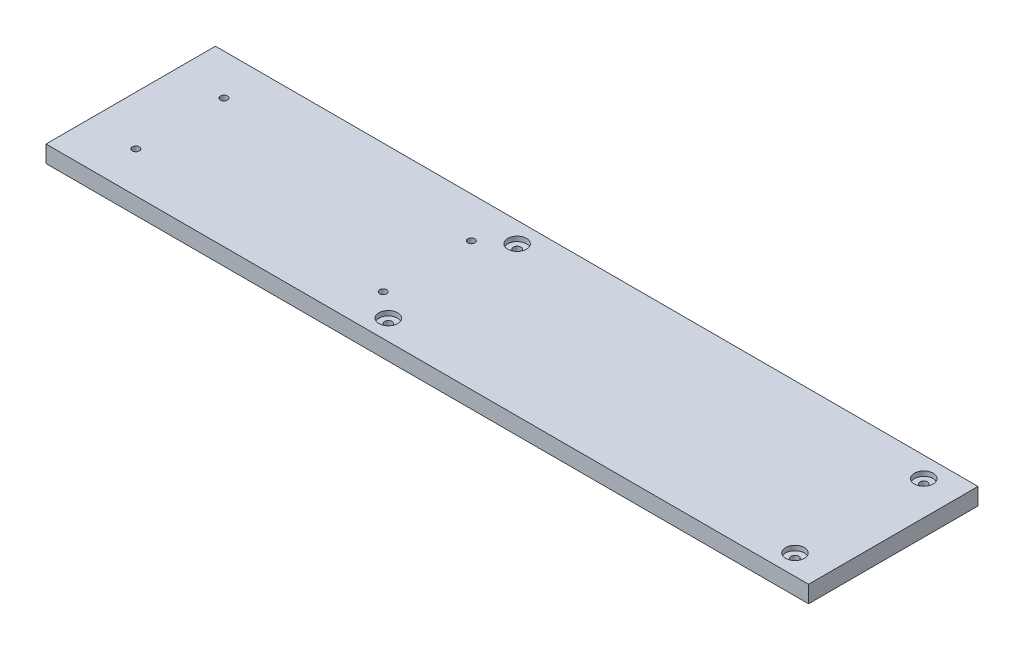
ISO-10303-21;
HEADER;
FILE_DESCRIPTION(('STEP AP214'),'2;1');
FILE_NAME('part.step','',(''),(''),'','','');
FILE_SCHEMA(('AUTOMOTIVE_DESIGN { 1 0 10303 214 1 1 1 1 }'));
ENDSEC;
DATA;
#1=APPLICATION_CONTEXT('core data for automotive mechanical design processes');
#2=APPLICATION_PROTOCOL_DEFINITION('international standard','automotive_design',2000,#1);
#3=PRODUCT_CONTEXT('',#1,'mechanical');
#4=PRODUCT('Part','Part','',(#3));
#5=PRODUCT_RELATED_PRODUCT_CATEGORY('part','',(#4));
#6=PRODUCT_DEFINITION_FORMATION('','',#4);
#7=PRODUCT_DEFINITION_CONTEXT('part definition',#1,'design');
#8=PRODUCT_DEFINITION('design','',#6,#7);
#9=PRODUCT_DEFINITION_SHAPE('','',#8);
#10=(LENGTH_UNIT() NAMED_UNIT(*) SI_UNIT(.MILLI.,.METRE.));
#11=(NAMED_UNIT(*) PLANE_ANGLE_UNIT() SI_UNIT($,.RADIAN.));
#12=(NAMED_UNIT(*) SI_UNIT($,.STERADIAN.) SOLID_ANGLE_UNIT());
#13=UNCERTAINTY_MEASURE_WITH_UNIT(LENGTH_MEASURE(1.E-05),#10,'distance_accuracy_value','');
#14=(GEOMETRIC_REPRESENTATION_CONTEXT(3) GLOBAL_UNCERTAINTY_ASSIGNED_CONTEXT((#13)) GLOBAL_UNIT_ASSIGNED_CONTEXT((#10,
#11,#12)) REPRESENTATION_CONTEXT('',''));
#15=CARTESIAN_POINT('',(0.,0.,0.));
#16=DIRECTION('',(0.,0.,1.));
#17=DIRECTION('',(1.,0.,0.));
#18=AXIS2_PLACEMENT_3D('',#15,#16,#17);
#19=CARTESIAN_POINT('',(225.,10.,-50.));
#20=DIRECTION('',(-1.,0.,0.));
#21=DIRECTION('',(0.,0.,1.));
#22=AXIS2_PLACEMENT_3D('',#19,#20,#21);
#23=PLANE('',#22);
#24=DIRECTION('',(0.,0.,-1.));
#25=VECTOR('',#24,1.);
#26=CARTESIAN_POINT('',(225.,0.,-50.));
#27=LINE('',#26,#25);
#28=CARTESIAN_POINT('',(225.,0.,50.));
#29=VERTEX_POINT('',#28);
#30=CARTESIAN_POINT('',(225.,0.,-50.));
#31=VERTEX_POINT('',#30);
#32=EDGE_CURVE('E111',#29,#31,#27,.T.);
#33=ORIENTED_EDGE('',*,*,#32,.T.);
#34=DIRECTION('',(0.,-1.,0.));
#35=VECTOR('',#34,1.);
#36=CARTESIAN_POINT('',(225.,10.,-50.));
#37=LINE('',#36,#35);
#38=CARTESIAN_POINT('',(225.,10.,-50.));
#39=VERTEX_POINT('',#38);
#40=EDGE_CURVE('E11',#39,#31,#37,.T.);
#41=ORIENTED_EDGE('',*,*,#40,.F.);
#42=DIRECTION('',(0.,0.,-1.));
#43=VECTOR('',#42,1.);
#44=CARTESIAN_POINT('',(225.,10.,-50.));
#45=LINE('',#44,#43);
#46=CARTESIAN_POINT('',(225.,10.,50.));
#47=VERTEX_POINT('',#46);
#48=EDGE_CURVE('E95',#47,#39,#45,.T.);
#49=ORIENTED_EDGE('',*,*,#48,.F.);
#50=DIRECTION('',(0.,-1.,0.));
#51=VECTOR('',#50,1.);
#52=CARTESIAN_POINT('',(225.,10.,50.));
#53=LINE('',#52,#51);
#54=EDGE_CURVE('E107',#47,#29,#53,.T.);
#55=ORIENTED_EDGE('',*,*,#54,.T.);
#56=EDGE_LOOP('',(#33,#41,#49,#55));
#57=FACE_BOUND('',#56,.T.);
#58=ADVANCED_FACE('F43',(#57),#23,.F.);
#59=CARTESIAN_POINT('',(-225.,10.,-50.));
#60=DIRECTION('',(0.,0.,1.));
#61=DIRECTION('',(1.,0.,0.));
#62=AXIS2_PLACEMENT_3D('',#59,#60,#61);
#63=PLANE('',#62);
#64=DIRECTION('',(-1.,0.,0.));
#65=VECTOR('',#64,1.);
#66=CARTESIAN_POINT('',(-225.,0.,-50.));
#67=LINE('',#66,#65);
#68=CARTESIAN_POINT('',(-225.,0.,-50.));
#69=VERTEX_POINT('',#68);
#70=EDGE_CURVE('E100',#31,#69,#67,.T.);
#71=ORIENTED_EDGE('',*,*,#70,.T.);
#72=DIRECTION('',(0.,-1.,0.));
#73=VECTOR('',#72,1.);
#74=CARTESIAN_POINT('',(-225.,10.,-50.));
#75=LINE('',#74,#73);
#76=CARTESIAN_POINT('',(-225.,10.,-50.));
#77=VERTEX_POINT('',#76);
#78=EDGE_CURVE('E52',#77,#69,#75,.T.);
#79=ORIENTED_EDGE('',*,*,#78,.F.);
#80=DIRECTION('',(-1.,0.,0.));
#81=VECTOR('',#80,1.);
#82=CARTESIAN_POINT('',(-225.,10.,-50.));
#83=LINE('',#82,#81);
#84=EDGE_CURVE('E90',#39,#77,#83,.T.);
#85=ORIENTED_EDGE('',*,*,#84,.F.);
#86=ORIENTED_EDGE('',*,*,#40,.T.);
#87=EDGE_LOOP('',(#71,#79,#85,#86));
#88=FACE_BOUND('',#87,.T.);
#89=ADVANCED_FACE('F99',(#88),#63,.F.);
#90=CARTESIAN_POINT('',(-225.,10.,-50.));
#91=DIRECTION('',(1.,0.,0.));
#92=DIRECTION('',(0.,0.,-1.));
#93=AXIS2_PLACEMENT_3D('',#90,#91,#92);
#94=PLANE('',#93);
#95=DIRECTION('',(0.,0.,1.));
#96=VECTOR('',#95,1.);
#97=CARTESIAN_POINT('',(-225.,0.,-50.));
#98=LINE('',#97,#96);
#99=CARTESIAN_POINT('',(-225.,0.,50.));
#100=VERTEX_POINT('',#99);
#101=EDGE_CURVE('E77',#69,#100,#98,.T.);
#102=ORIENTED_EDGE('',*,*,#101,.T.);
#103=DIRECTION('',(0.,-1.,0.));
#104=VECTOR('',#103,1.);
#105=CARTESIAN_POINT('',(-225.,10.,50.));
#106=LINE('',#105,#104);
#107=CARTESIAN_POINT('',(-225.,10.,50.));
#108=VERTEX_POINT('',#107);
#109=EDGE_CURVE('E102',#108,#100,#106,.T.);
#110=ORIENTED_EDGE('',*,*,#109,.F.);
#111=DIRECTION('',(0.,0.,1.));
#112=VECTOR('',#111,1.);
#113=CARTESIAN_POINT('',(-225.,10.,-50.));
#114=LINE('',#113,#112);
#115=EDGE_CURVE('E93',#77,#108,#114,.T.);
#116=ORIENTED_EDGE('',*,*,#115,.F.);
#117=ORIENTED_EDGE('',*,*,#78,.T.);
#118=EDGE_LOOP('',(#102,#110,#116,#117));
#119=FACE_BOUND('',#118,.T.);
#120=ADVANCED_FACE('F103',(#119),#94,.F.);
#121=CARTESIAN_POINT('',(-225.,10.,50.));
#122=DIRECTION('',(0.,0.,-1.));
#123=DIRECTION('',(-1.,0.,0.));
#124=AXIS2_PLACEMENT_3D('',#121,#122,#123);
#125=PLANE('',#124);
#126=DIRECTION('',(1.,0.,0.));
#127=VECTOR('',#126,1.);
#128=CARTESIAN_POINT('',(-225.,0.,50.));
#129=LINE('',#128,#127);
#130=EDGE_CURVE('E83',#100,#29,#129,.T.);
#131=ORIENTED_EDGE('',*,*,#130,.T.);
#132=ORIENTED_EDGE('',*,*,#54,.F.);
#133=DIRECTION('',(1.,0.,0.));
#134=VECTOR('',#133,1.);
#135=CARTESIAN_POINT('',(-225.,10.,50.));
#136=LINE('',#135,#134);
#137=EDGE_CURVE('E60',#108,#47,#136,.T.);
#138=ORIENTED_EDGE('',*,*,#137,.F.);
#139=ORIENTED_EDGE('',*,*,#109,.T.);
#140=EDGE_LOOP('',(#131,#132,#138,#139));
#141=FACE_BOUND('',#140,.T.);
#142=ADVANCED_FACE('F125',(#141),#125,.F.);
#143=CARTESIAN_POINT('',(0.,10.,0.));
#144=DIRECTION('',(0.,1.,0.));
#145=DIRECTION('',(0.,0.,1.));
#146=AXIS2_PLACEMENT_3D('',#143,#144,#145);
#147=PLANE('',#146);
#148=CARTESIAN_POINT('',(-50.,10.,-26.));
#149=DIRECTION('',(0.,1.,0.));
#150=DIRECTION('',(0.,0.,1.));
#151=AXIS2_PLACEMENT_3D('',#148,#149,#150);
#152=CIRCLE('',#151,2.1);
#153=CARTESIAN_POINT('',(-50.,10.,-23.9));
#154=VERTEX_POINT('',#153);
#155=EDGE_CURVE('E223',#154,#154,#152,.T.);
#156=ORIENTED_EDGE('',*,*,#155,.F.);
#157=EDGE_LOOP('',(#156));
#158=FACE_BOUND('',#157,.T.);
#159=CARTESIAN_POINT('',(-50.,10.,26.));
#160=DIRECTION('',(0.,1.,0.));
#161=DIRECTION('',(0.,0.,1.));
#162=AXIS2_PLACEMENT_3D('',#159,#160,#161);
#163=CIRCLE('',#162,2.1);
#164=CARTESIAN_POINT('',(-50.,10.,28.1));
#165=VERTEX_POINT('',#164);
#166=EDGE_CURVE('E215',#165,#165,#163,.T.);
#167=ORIENTED_EDGE('',*,*,#166,.F.);
#168=EDGE_LOOP('',(#167));
#169=FACE_BOUND('',#168,.T.);
#170=CARTESIAN_POINT('',(-196.,10.,26.));
#171=DIRECTION('',(0.,1.,0.));
#172=DIRECTION('',(0.,0.,1.));
#173=AXIS2_PLACEMENT_3D('',#170,#171,#172);
#174=CIRCLE('',#173,2.09999999999999);
#175=CARTESIAN_POINT('',(-196.,10.,28.1));
#176=VERTEX_POINT('',#175);
#177=EDGE_CURVE('E207',#176,#176,#174,.T.);
#178=ORIENTED_EDGE('',*,*,#177,.F.);
#179=EDGE_LOOP('',(#178));
#180=FACE_BOUND('',#179,.T.);
#181=CARTESIAN_POINT('',(-196.,10.,-26.));
#182=DIRECTION('',(0.,1.,0.));
#183=DIRECTION('',(0.,0.,1.));
#184=AXIS2_PLACEMENT_3D('',#181,#182,#183);
#185=CIRCLE('',#184,2.09999999999999);
#186=CARTESIAN_POINT('',(-196.,10.,-23.9));
#187=VERTEX_POINT('',#186);
#188=EDGE_CURVE('E199',#187,#187,#185,.T.);
#189=ORIENTED_EDGE('',*,*,#188,.F.);
#190=EDGE_LOOP('',(#189));
#191=FACE_BOUND('',#190,.T.);
#192=CARTESIAN_POINT('',(205.,10.,38.));
#193=DIRECTION('',(0.,1.,0.));
#194=DIRECTION('',(0.,0.,1.));
#195=AXIS2_PLACEMENT_3D('',#192,#193,#194);
#196=CIRCLE('',#195,5.5415);
#197=CARTESIAN_POINT('',(205.,10.,43.5415));
#198=VERTEX_POINT('',#197);
#199=EDGE_CURVE('E191',#198,#198,#196,.T.);
#200=ORIENTED_EDGE('',*,*,#199,.F.);
#201=EDGE_LOOP('',(#200));
#202=FACE_BOUND('',#201,.T.);
#203=CARTESIAN_POINT('',(205.,10.,-38.));
#204=DIRECTION('',(0.,1.,0.));
#205=DIRECTION('',(0.,0.,1.));
#206=AXIS2_PLACEMENT_3D('',#203,#204,#205);
#207=CIRCLE('',#206,5.5415);
#208=CARTESIAN_POINT('',(205.,10.,-32.4585));
#209=VERTEX_POINT('',#208);
#210=EDGE_CURVE('E175',#209,#209,#207,.T.);
#211=ORIENTED_EDGE('',*,*,#210,.F.);
#212=EDGE_LOOP('',(#211));
#213=FACE_BOUND('',#212,.T.);
#214=CARTESIAN_POINT('',(-35.,10.,-38.));
#215=DIRECTION('',(0.,1.,0.));
#216=DIRECTION('',(0.,0.,1.));
#217=AXIS2_PLACEMENT_3D('',#214,#215,#216);
#218=CIRCLE('',#217,5.5415);
#219=CARTESIAN_POINT('',(-35.,10.,-32.4585));
#220=VERTEX_POINT('',#219);
#221=EDGE_CURVE('E159',#220,#220,#218,.T.);
#222=ORIENTED_EDGE('',*,*,#221,.F.);
#223=EDGE_LOOP('',(#222));
#224=FACE_BOUND('',#223,.T.);
#225=CARTESIAN_POINT('',(-35.,10.,38.));
#226=DIRECTION('',(0.,1.,0.));
#227=DIRECTION('',(0.,0.,1.));
#228=AXIS2_PLACEMENT_3D('',#225,#226,#227);
#229=CIRCLE('',#228,5.5415);
#230=CARTESIAN_POINT('',(-35.,10.,43.5415));
#231=VERTEX_POINT('',#230);
#232=EDGE_CURVE('E143',#231,#231,#229,.T.);
#233=ORIENTED_EDGE('',*,*,#232,.F.);
#234=EDGE_LOOP('',(#233));
#235=FACE_BOUND('',#234,.T.);
#236=ORIENTED_EDGE('',*,*,#48,.T.);
#237=ORIENTED_EDGE('',*,*,#84,.T.);
#238=ORIENTED_EDGE('',*,*,#115,.T.);
#239=ORIENTED_EDGE('',*,*,#137,.T.);
#240=EDGE_LOOP('',(#236,#237,#238,#239));
#241=FACE_BOUND('',#240,.T.);
#242=ADVANCED_FACE('F91',(#158,#169,#180,#191,#202,#213,#224,#235,#241),#147,.T.);
#243=CARTESIAN_POINT('',(0.,0.,0.));
#244=DIRECTION('',(0.,1.,0.));
#245=DIRECTION('',(0.,0.,1.));
#246=AXIS2_PLACEMENT_3D('',#243,#244,#245);
#247=PLANE('',#246);
#248=CARTESIAN_POINT('',(-50.,0.,-26.));
#249=DIRECTION('',(0.,1.,0.));
#250=DIRECTION('',(0.,0.,1.));
#251=AXIS2_PLACEMENT_3D('',#248,#249,#250);
#252=CIRCLE('',#251,2.1);
#253=CARTESIAN_POINT('',(-50.,0.,-23.9));
#254=VERTEX_POINT('',#253);
#255=EDGE_CURVE('E219',#254,#254,#252,.T.);
#256=ORIENTED_EDGE('',*,*,#255,.T.);
#257=EDGE_LOOP('',(#256));
#258=FACE_BOUND('',#257,.T.);
#259=CARTESIAN_POINT('',(-50.,0.,26.));
#260=DIRECTION('',(0.,1.,0.));
#261=DIRECTION('',(0.,0.,1.));
#262=AXIS2_PLACEMENT_3D('',#259,#260,#261);
#263=CIRCLE('',#262,2.1);
#264=CARTESIAN_POINT('',(-50.,0.,28.1));
#265=VERTEX_POINT('',#264);
#266=EDGE_CURVE('E211',#265,#265,#263,.T.);
#267=ORIENTED_EDGE('',*,*,#266,.T.);
#268=EDGE_LOOP('',(#267));
#269=FACE_BOUND('',#268,.T.);
#270=CARTESIAN_POINT('',(-196.,0.,26.));
#271=DIRECTION('',(0.,1.,0.));
#272=DIRECTION('',(0.,0.,1.));
#273=AXIS2_PLACEMENT_3D('',#270,#271,#272);
#274=CIRCLE('',#273,2.09999999999999);
#275=CARTESIAN_POINT('',(-196.,0.,28.1));
#276=VERTEX_POINT('',#275);
#277=EDGE_CURVE('E203',#276,#276,#274,.T.);
#278=ORIENTED_EDGE('',*,*,#277,.T.);
#279=EDGE_LOOP('',(#278));
#280=FACE_BOUND('',#279,.T.);
#281=CARTESIAN_POINT('',(-196.,0.,-26.));
#282=DIRECTION('',(0.,1.,0.));
#283=DIRECTION('',(0.,0.,1.));
#284=AXIS2_PLACEMENT_3D('',#281,#282,#283);
#285=CIRCLE('',#284,2.09999999999999);
#286=CARTESIAN_POINT('',(-196.,0.,-23.9));
#287=VERTEX_POINT('',#286);
#288=EDGE_CURVE('E195',#287,#287,#285,.T.);
#289=ORIENTED_EDGE('',*,*,#288,.T.);
#290=EDGE_LOOP('',(#289));
#291=FACE_BOUND('',#290,.T.);
#292=CARTESIAN_POINT('',(205.,0.,38.));
#293=DIRECTION('',(0.,1.,0.));
#294=DIRECTION('',(0.,0.,1.));
#295=AXIS2_PLACEMENT_3D('',#292,#293,#294);
#296=CIRCLE('',#295,2.25);
#297=CARTESIAN_POINT('',(205.,0.,40.25));
#298=VERTEX_POINT('',#297);
#299=EDGE_CURVE('E179',#298,#298,#296,.T.);
#300=ORIENTED_EDGE('',*,*,#299,.T.);
#301=EDGE_LOOP('',(#300));
#302=FACE_BOUND('',#301,.T.);
#303=CARTESIAN_POINT('',(205.,0.,-38.));
#304=DIRECTION('',(0.,1.,0.));
#305=DIRECTION('',(0.,0.,1.));
#306=AXIS2_PLACEMENT_3D('',#303,#304,#305);
#307=CIRCLE('',#306,2.25);
#308=CARTESIAN_POINT('',(205.,0.,-35.75));
#309=VERTEX_POINT('',#308);
#310=EDGE_CURVE('E163',#309,#309,#307,.T.);
#311=ORIENTED_EDGE('',*,*,#310,.T.);
#312=EDGE_LOOP('',(#311));
#313=FACE_BOUND('',#312,.T.);
#314=CARTESIAN_POINT('',(-35.,0.,-38.));
#315=DIRECTION('',(0.,1.,0.));
#316=DIRECTION('',(0.,0.,1.));
#317=AXIS2_PLACEMENT_3D('',#314,#315,#316);
#318=CIRCLE('',#317,2.25);
#319=CARTESIAN_POINT('',(-35.,0.,-35.75));
#320=VERTEX_POINT('',#319);
#321=EDGE_CURVE('E147',#320,#320,#318,.T.);
#322=ORIENTED_EDGE('',*,*,#321,.T.);
#323=EDGE_LOOP('',(#322));
#324=FACE_BOUND('',#323,.T.);
#325=CARTESIAN_POINT('',(-35.,0.,38.));
#326=DIRECTION('',(0.,1.,0.));
#327=DIRECTION('',(0.,0.,1.));
#328=AXIS2_PLACEMENT_3D('',#325,#326,#327);
#329=CIRCLE('',#328,2.25);
#330=CARTESIAN_POINT('',(-35.,0.,40.25));
#331=VERTEX_POINT('',#330);
#332=EDGE_CURVE('E115',#331,#331,#329,.T.);
#333=ORIENTED_EDGE('',*,*,#332,.T.);
#334=EDGE_LOOP('',(#333));
#335=FACE_BOUND('',#334,.T.);
#336=ORIENTED_EDGE('',*,*,#32,.F.);
#337=ORIENTED_EDGE('',*,*,#130,.F.);
#338=ORIENTED_EDGE('',*,*,#101,.F.);
#339=ORIENTED_EDGE('',*,*,#70,.F.);
#340=EDGE_LOOP('',(#336,#337,#338,#339));
#341=FACE_BOUND('',#340,.T.);
#342=ADVANCED_FACE('F128',(#258,#269,#280,#291,#302,#313,#324,#335,#341),#247,.F.);
#343=CARTESIAN_POINT('',(-35.,10.,38.));
#344=DIRECTION('',(0.,1.,0.));
#345=DIRECTION('',(0.,0.,1.));
#346=AXIS2_PLACEMENT_3D('',#343,#344,#345);
#347=CYLINDRICAL_SURFACE('',#346,2.25);
#348=ORIENTED_EDGE('',*,*,#332,.F.);
#349=EDGE_LOOP('',(#348));
#350=FACE_BOUND('',#349,.T.);
#351=CARTESIAN_POINT('',(-35.,7.2,38.));
#352=DIRECTION('',(0.,1.,0.));
#353=DIRECTION('',(0.,0.,1.));
#354=AXIS2_PLACEMENT_3D('',#351,#352,#353);
#355=CIRCLE('',#354,2.25);
#356=CARTESIAN_POINT('',(-35.,7.2,40.25));
#357=VERTEX_POINT('',#356);
#358=EDGE_CURVE('E135',#357,#357,#355,.T.);
#359=ORIENTED_EDGE('',*,*,#358,.T.);
#360=EDGE_LOOP('',(#359));
#361=FACE_BOUND('',#360,.T.);
#362=ADVANCED_FACE('F260',(#350,#361),#347,.F.);
#363=CARTESIAN_POINT('',(-32.7499999999999,7.2,38.));
#364=DIRECTION('',(0.,-1.,0.));
#365=DIRECTION('',(0.,0.,-1.));
#366=AXIS2_PLACEMENT_3D('',#363,#364,#365);
#367=PLANE('',#366);
#368=ORIENTED_EDGE('',*,*,#358,.F.);
#369=EDGE_LOOP('',(#368));
#370=FACE_BOUND('',#369,.T.);
#371=CARTESIAN_POINT('',(-35.,7.2,38.));
#372=DIRECTION('',(0.,1.,0.));
#373=DIRECTION('',(0.,0.,1.));
#374=AXIS2_PLACEMENT_3D('',#371,#372,#373);
#375=CIRCLE('',#374,5.5415);
#376=CARTESIAN_POINT('',(-35.,7.2,43.5415));
#377=VERTEX_POINT('',#376);
#378=EDGE_CURVE('E139',#377,#377,#375,.T.);
#379=ORIENTED_EDGE('',*,*,#378,.T.);
#380=EDGE_LOOP('',(#379));
#381=FACE_BOUND('',#380,.T.);
#382=ADVANCED_FACE('F250',(#370,#381),#367,.F.);
#383=CARTESIAN_POINT('',(-35.,10.,38.));
#384=DIRECTION('',(0.,1.,0.));
#385=DIRECTION('',(0.,0.,1.));
#386=AXIS2_PLACEMENT_3D('',#383,#384,#385);
#387=CYLINDRICAL_SURFACE('',#386,5.5415);
#388=ORIENTED_EDGE('',*,*,#378,.F.);
#389=EDGE_LOOP('',(#388));
#390=FACE_BOUND('',#389,.T.);
#391=ORIENTED_EDGE('',*,*,#232,.T.);
#392=EDGE_LOOP('',(#391));
#393=FACE_BOUND('',#392,.T.);
#394=ADVANCED_FACE('F247',(#390,#393),#387,.F.);
#395=CARTESIAN_POINT('',(-35.,10.,-38.));
#396=DIRECTION('',(0.,1.,0.));
#397=DIRECTION('',(0.,0.,1.));
#398=AXIS2_PLACEMENT_3D('',#395,#396,#397);
#399=CYLINDRICAL_SURFACE('',#398,2.25);
#400=ORIENTED_EDGE('',*,*,#321,.F.);
#401=EDGE_LOOP('',(#400));
#402=FACE_BOUND('',#401,.T.);
#403=CARTESIAN_POINT('',(-35.,7.2,-38.));
#404=DIRECTION('',(0.,1.,0.));
#405=DIRECTION('',(0.,0.,1.));
#406=AXIS2_PLACEMENT_3D('',#403,#404,#405);
#407=CIRCLE('',#406,2.25);
#408=CARTESIAN_POINT('',(-35.,7.2,-35.75));
#409=VERTEX_POINT('',#408);
#410=EDGE_CURVE('E151',#409,#409,#407,.T.);
#411=ORIENTED_EDGE('',*,*,#410,.T.);
#412=EDGE_LOOP('',(#411));
#413=FACE_BOUND('',#412,.T.);
#414=ADVANCED_FACE('F249',(#402,#413),#399,.F.);
#415=CARTESIAN_POINT('',(-32.7499999999999,7.2,-38.));
#416=DIRECTION('',(0.,-1.,0.));
#417=DIRECTION('',(0.,0.,-1.));
#418=AXIS2_PLACEMENT_3D('',#415,#416,#417);
#419=PLANE('',#418);
#420=ORIENTED_EDGE('',*,*,#410,.F.);
#421=EDGE_LOOP('',(#420));
#422=FACE_BOUND('',#421,.T.);
#423=CARTESIAN_POINT('',(-35.,7.2,-38.));
#424=DIRECTION('',(0.,1.,0.));
#425=DIRECTION('',(0.,0.,1.));
#426=AXIS2_PLACEMENT_3D('',#423,#424,#425);
#427=CIRCLE('',#426,5.5415);
#428=CARTESIAN_POINT('',(-35.,7.2,-32.4585));
#429=VERTEX_POINT('',#428);
#430=EDGE_CURVE('E155',#429,#429,#427,.T.);
#431=ORIENTED_EDGE('',*,*,#430,.T.);
#432=EDGE_LOOP('',(#431));
#433=FACE_BOUND('',#432,.T.);
#434=ADVANCED_FACE('F257',(#422,#433),#419,.F.);
#435=CARTESIAN_POINT('',(-35.,10.,-38.));
#436=DIRECTION('',(0.,1.,0.));
#437=DIRECTION('',(0.,0.,1.));
#438=AXIS2_PLACEMENT_3D('',#435,#436,#437);
#439=CYLINDRICAL_SURFACE('',#438,5.5415);
#440=ORIENTED_EDGE('',*,*,#430,.F.);
#441=EDGE_LOOP('',(#440));
#442=FACE_BOUND('',#441,.T.);
#443=ORIENTED_EDGE('',*,*,#221,.T.);
#444=EDGE_LOOP('',(#443));
#445=FACE_BOUND('',#444,.T.);
#446=ADVANCED_FACE('F313',(#442,#445),#439,.F.);
#447=CARTESIAN_POINT('',(205.,10.,-38.));
#448=DIRECTION('',(0.,1.,0.));
#449=DIRECTION('',(0.,0.,1.));
#450=AXIS2_PLACEMENT_3D('',#447,#448,#449);
#451=CYLINDRICAL_SURFACE('',#450,2.25);
#452=ORIENTED_EDGE('',*,*,#310,.F.);
#453=EDGE_LOOP('',(#452));
#454=FACE_BOUND('',#453,.T.);
#455=CARTESIAN_POINT('',(205.,7.2,-38.));
#456=DIRECTION('',(0.,1.,0.));
#457=DIRECTION('',(0.,0.,1.));
#458=AXIS2_PLACEMENT_3D('',#455,#456,#457);
#459=CIRCLE('',#458,2.25);
#460=CARTESIAN_POINT('',(205.,7.2,-35.75));
#461=VERTEX_POINT('',#460);
#462=EDGE_CURVE('E167',#461,#461,#459,.T.);
#463=ORIENTED_EDGE('',*,*,#462,.T.);
#464=EDGE_LOOP('',(#463));
#465=FACE_BOUND('',#464,.T.);
#466=ADVANCED_FACE('F323',(#454,#465),#451,.F.);
#467=CARTESIAN_POINT('',(207.25,7.2,-38.));
#468=DIRECTION('',(0.,-1.,0.));
#469=DIRECTION('',(0.,0.,-1.));
#470=AXIS2_PLACEMENT_3D('',#467,#468,#469);
#471=PLANE('',#470);
#472=ORIENTED_EDGE('',*,*,#462,.F.);
#473=EDGE_LOOP('',(#472));
#474=FACE_BOUND('',#473,.T.);
#475=CARTESIAN_POINT('',(205.,7.2,-38.));
#476=DIRECTION('',(0.,1.,0.));
#477=DIRECTION('',(0.,0.,1.));
#478=AXIS2_PLACEMENT_3D('',#475,#476,#477);
#479=CIRCLE('',#478,5.5415);
#480=CARTESIAN_POINT('',(205.,7.2,-32.4585));
#481=VERTEX_POINT('',#480);
#482=EDGE_CURVE('E171',#481,#481,#479,.T.);
#483=ORIENTED_EDGE('',*,*,#482,.T.);
#484=EDGE_LOOP('',(#483));
#485=FACE_BOUND('',#484,.T.);
#486=ADVANCED_FACE('F333',(#474,#485),#471,.F.);
#487=CARTESIAN_POINT('',(205.,10.,-38.));
#488=DIRECTION('',(0.,1.,0.));
#489=DIRECTION('',(0.,0.,1.));
#490=AXIS2_PLACEMENT_3D('',#487,#488,#489);
#491=CYLINDRICAL_SURFACE('',#490,5.5415);
#492=ORIENTED_EDGE('',*,*,#482,.F.);
#493=EDGE_LOOP('',(#492));
#494=FACE_BOUND('',#493,.T.);
#495=ORIENTED_EDGE('',*,*,#210,.T.);
#496=EDGE_LOOP('',(#495));
#497=FACE_BOUND('',#496,.T.);
#498=ADVANCED_FACE('F343',(#494,#497),#491,.F.);
#499=CARTESIAN_POINT('',(205.,10.,38.));
#500=DIRECTION('',(0.,1.,0.));
#501=DIRECTION('',(0.,0.,1.));
#502=AXIS2_PLACEMENT_3D('',#499,#500,#501);
#503=CYLINDRICAL_SURFACE('',#502,2.25);
#504=ORIENTED_EDGE('',*,*,#299,.F.);
#505=EDGE_LOOP('',(#504));
#506=FACE_BOUND('',#505,.T.);
#507=CARTESIAN_POINT('',(205.,7.2,38.));
#508=DIRECTION('',(0.,1.,0.));
#509=DIRECTION('',(0.,0.,1.));
#510=AXIS2_PLACEMENT_3D('',#507,#508,#509);
#511=CIRCLE('',#510,2.25);
#512=CARTESIAN_POINT('',(205.,7.2,40.25));
#513=VERTEX_POINT('',#512);
#514=EDGE_CURVE('E183',#513,#513,#511,.T.);
#515=ORIENTED_EDGE('',*,*,#514,.T.);
#516=EDGE_LOOP('',(#515));
#517=FACE_BOUND('',#516,.T.);
#518=ADVANCED_FACE('F353',(#506,#517),#503,.F.);
#519=CARTESIAN_POINT('',(207.25,7.2,38.));
#520=DIRECTION('',(0.,-1.,0.));
#521=DIRECTION('',(0.,0.,-1.));
#522=AXIS2_PLACEMENT_3D('',#519,#520,#521);
#523=PLANE('',#522);
#524=ORIENTED_EDGE('',*,*,#514,.F.);
#525=EDGE_LOOP('',(#524));
#526=FACE_BOUND('',#525,.T.);
#527=CARTESIAN_POINT('',(205.,7.2,38.));
#528=DIRECTION('',(0.,1.,0.));
#529=DIRECTION('',(0.,0.,1.));
#530=AXIS2_PLACEMENT_3D('',#527,#528,#529);
#531=CIRCLE('',#530,5.5415);
#532=CARTESIAN_POINT('',(205.,7.2,43.5415));
#533=VERTEX_POINT('',#532);
#534=EDGE_CURVE('E187',#533,#533,#531,.T.);
#535=ORIENTED_EDGE('',*,*,#534,.T.);
#536=EDGE_LOOP('',(#535));
#537=FACE_BOUND('',#536,.T.);
#538=ADVANCED_FACE('F363',(#526,#537),#523,.F.);
#539=CARTESIAN_POINT('',(205.,10.,38.));
#540=DIRECTION('',(0.,1.,0.));
#541=DIRECTION('',(0.,0.,1.));
#542=AXIS2_PLACEMENT_3D('',#539,#540,#541);
#543=CYLINDRICAL_SURFACE('',#542,5.5415);
#544=ORIENTED_EDGE('',*,*,#534,.F.);
#545=EDGE_LOOP('',(#544));
#546=FACE_BOUND('',#545,.T.);
#547=ORIENTED_EDGE('',*,*,#199,.T.);
#548=EDGE_LOOP('',(#547));
#549=FACE_BOUND('',#548,.T.);
#550=ADVANCED_FACE('F373',(#546,#549),#543,.F.);
#551=CARTESIAN_POINT('',(-196.,10.,-26.));
#552=DIRECTION('',(0.,1.,0.));
#553=DIRECTION('',(0.,0.,1.));
#554=AXIS2_PLACEMENT_3D('',#551,#552,#553);
#555=CYLINDRICAL_SURFACE('',#554,2.09999999999999);
#556=ORIENTED_EDGE('',*,*,#288,.F.);
#557=EDGE_LOOP('',(#556));
#558=FACE_BOUND('',#557,.T.);
#559=ORIENTED_EDGE('',*,*,#188,.T.);
#560=EDGE_LOOP('',(#559));
#561=FACE_BOUND('',#560,.T.);
#562=ADVANCED_FACE('F383',(#558,#561),#555,.F.);
#563=CARTESIAN_POINT('',(-196.,10.,26.));
#564=DIRECTION('',(0.,1.,0.));
#565=DIRECTION('',(0.,0.,1.));
#566=AXIS2_PLACEMENT_3D('',#563,#564,#565);
#567=CYLINDRICAL_SURFACE('',#566,2.09999999999999);
#568=ORIENTED_EDGE('',*,*,#277,.F.);
#569=EDGE_LOOP('',(#568));
#570=FACE_BOUND('',#569,.T.);
#571=ORIENTED_EDGE('',*,*,#177,.T.);
#572=EDGE_LOOP('',(#571));
#573=FACE_BOUND('',#572,.T.);
#574=ADVANCED_FACE('F409',(#570,#573),#567,.F.);
#575=CARTESIAN_POINT('',(-50.,10.,26.));
#576=DIRECTION('',(0.,1.,0.));
#577=DIRECTION('',(0.,0.,1.));
#578=AXIS2_PLACEMENT_3D('',#575,#576,#577);
#579=CYLINDRICAL_SURFACE('',#578,2.1);
#580=ORIENTED_EDGE('',*,*,#266,.F.);
#581=EDGE_LOOP('',(#580));
#582=FACE_BOUND('',#581,.T.);
#583=ORIENTED_EDGE('',*,*,#166,.T.);
#584=EDGE_LOOP('',(#583));
#585=FACE_BOUND('',#584,.T.);
#586=ADVANCED_FACE('F420',(#582,#585),#579,.F.);
#587=CARTESIAN_POINT('',(-50.,10.,-26.));
#588=DIRECTION('',(0.,1.,0.));
#589=DIRECTION('',(0.,0.,1.));
#590=AXIS2_PLACEMENT_3D('',#587,#588,#589);
#591=CYLINDRICAL_SURFACE('',#590,2.1);
#592=ORIENTED_EDGE('',*,*,#255,.F.);
#593=EDGE_LOOP('',(#592));
#594=FACE_BOUND('',#593,.T.);
#595=ORIENTED_EDGE('',*,*,#155,.T.);
#596=EDGE_LOOP('',(#595));
#597=FACE_BOUND('',#596,.T.);
#598=ADVANCED_FACE('F228',(#594,#597),#591,.F.);
#599=CLOSED_SHELL('',(#58,#89,#120,#142,#242,#342,#362,#382,#394,#414,#434,#446,#466,#486,#498,
#518,#538,#550,#562,#574,#586,#598));
#600=MANIFOLD_SOLID_BREP('B2',#599);
#601=ADVANCED_BREP_SHAPE_REPRESENTATION('',(#18,#600),#14);
#602=SHAPE_DEFINITION_REPRESENTATION(#9,#601);
ENDSEC;
END-ISO-10303-21;
